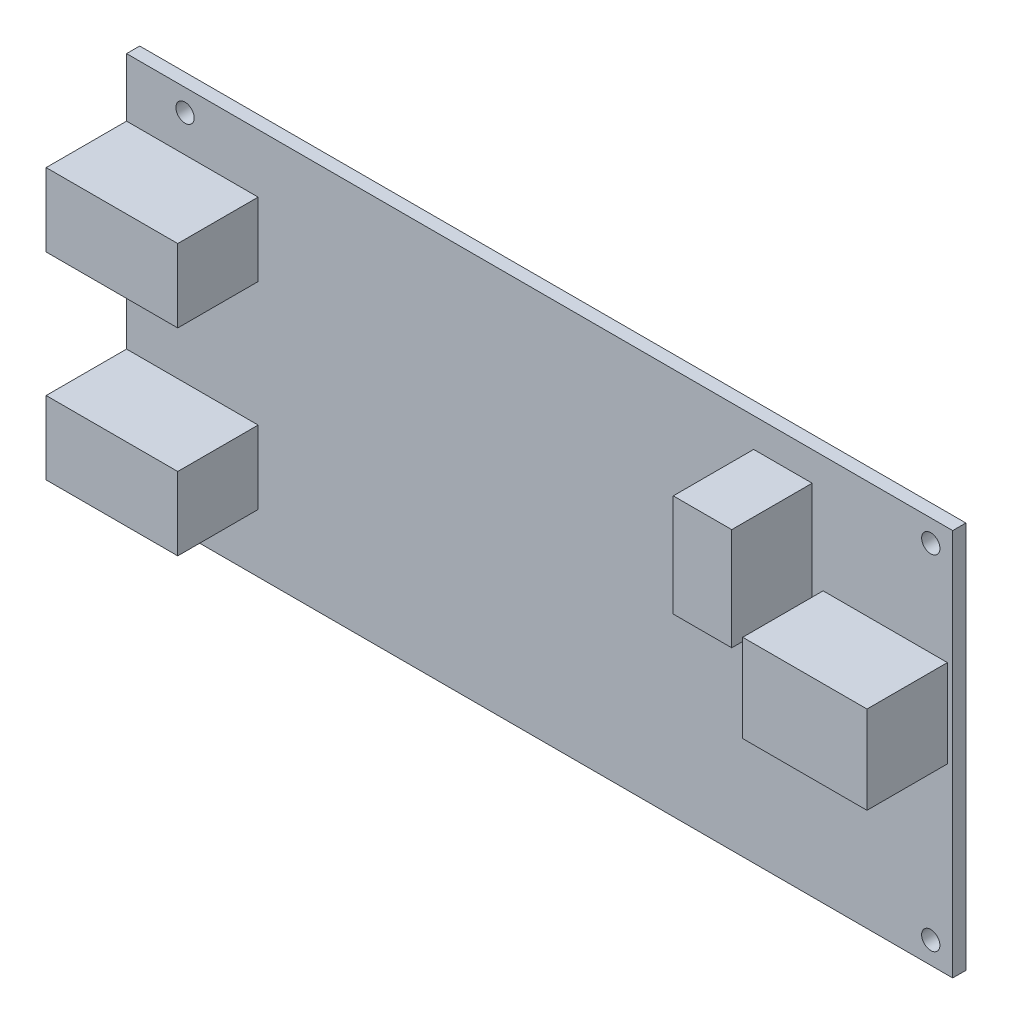
ISO-10303-21;
HEADER;
FILE_DESCRIPTION(('STEP AP214'),'2;1');
FILE_NAME('part.step','',(''),(''),'','','');
FILE_SCHEMA(('AUTOMOTIVE_DESIGN { 1 0 10303 214 1 1 1 1 }'));
ENDSEC;
DATA;
#1=APPLICATION_CONTEXT('core data for automotive mechanical design processes');
#2=APPLICATION_PROTOCOL_DEFINITION('international standard','automotive_design',2000,#1);
#3=PRODUCT_CONTEXT('',#1,'mechanical');
#4=PRODUCT('Part','Part','',(#3));
#5=PRODUCT_RELATED_PRODUCT_CATEGORY('part','',(#4));
#6=PRODUCT_DEFINITION_FORMATION('','',#4);
#7=PRODUCT_DEFINITION_CONTEXT('part definition',#1,'design');
#8=PRODUCT_DEFINITION('design','',#6,#7);
#9=PRODUCT_DEFINITION_SHAPE('','',#8);
#10=(LENGTH_UNIT() NAMED_UNIT(*) SI_UNIT(.MILLI.,.METRE.));
#11=(NAMED_UNIT(*) PLANE_ANGLE_UNIT() SI_UNIT($,.RADIAN.));
#12=(NAMED_UNIT(*) SI_UNIT($,.STERADIAN.) SOLID_ANGLE_UNIT());
#13=UNCERTAINTY_MEASURE_WITH_UNIT(LENGTH_MEASURE(1.E-05),#10,'distance_accuracy_value','');
#14=(GEOMETRIC_REPRESENTATION_CONTEXT(3) GLOBAL_UNCERTAINTY_ASSIGNED_CONTEXT((#13)) GLOBAL_UNIT_ASSIGNED_CONTEXT((#10,
#11,#12)) REPRESENTATION_CONTEXT('',''));
#15=CARTESIAN_POINT('',(0.,0.,0.));
#16=DIRECTION('',(0.,0.,1.));
#17=DIRECTION('',(1.,0.,0.));
#18=AXIS2_PLACEMENT_3D('',#15,#16,#17);
#19=CARTESIAN_POINT('',(0.,0.,1.8));
#20=DIRECTION('',(0.,0.,1.));
#21=DIRECTION('',(1.,0.,0.));
#22=AXIS2_PLACEMENT_3D('',#19,#20,#21);
#23=PLANE('',#22);
#24=CARTESIAN_POINT('',(-105.,50.,1.8));
#25=DIRECTION('',(0.,0.,1.));
#26=DIRECTION('',(1.,0.,0.));
#27=AXIS2_PLACEMENT_3D('',#24,#25,#26);
#28=CIRCLE('',#27,1.25);
#29=CARTESIAN_POINT('',(-103.75,50.,1.8));
#30=VERTEX_POINT('',#29);
#31=EDGE_CURVE('E293',#30,#30,#28,.T.);
#32=ORIENTED_EDGE('',*,*,#31,.F.);
#33=EDGE_LOOP('',(#32));
#34=FACE_BOUND('',#33,.T.);
#35=CARTESIAN_POINT('',(-3.,3.,1.8));
#36=DIRECTION('',(0.,0.,1.));
#37=DIRECTION('',(1.,0.,0.));
#38=AXIS2_PLACEMENT_3D('',#35,#36,#37);
#39=CIRCLE('',#38,1.25);
#40=CARTESIAN_POINT('',(-1.75,3.,1.8));
#41=VERTEX_POINT('',#40);
#42=EDGE_CURVE('E305',#41,#41,#39,.T.);
#43=ORIENTED_EDGE('',*,*,#42,.F.);
#44=EDGE_LOOP('',(#43));
#45=FACE_BOUND('',#44,.T.);
#46=CARTESIAN_POINT('',(-3.,50.,1.8));
#47=DIRECTION('',(0.,0.,1.));
#48=DIRECTION('',(1.,0.,0.));
#49=AXIS2_PLACEMENT_3D('',#46,#47,#48);
#50=CIRCLE('',#49,1.25);
#51=CARTESIAN_POINT('',(-1.75,50.,1.8));
#52=VERTEX_POINT('',#51);
#53=EDGE_CURVE('E299',#52,#52,#50,.T.);
#54=ORIENTED_EDGE('',*,*,#53,.F.);
#55=EDGE_LOOP('',(#54));
#56=FACE_BOUND('',#55,.T.);
#57=CARTESIAN_POINT('',(-105.,2.99999999999999,1.8));
#58=DIRECTION('',(0.,0.,1.));
#59=DIRECTION('',(1.,0.,0.));
#60=AXIS2_PLACEMENT_3D('',#57,#58,#59);
#61=CIRCLE('',#60,1.25);
#62=CARTESIAN_POINT('',(-103.75,2.99999999999999,1.8));
#63=VERTEX_POINT('',#62);
#64=EDGE_CURVE('E287',#63,#63,#61,.T.);
#65=ORIENTED_EDGE('',*,*,#64,.F.);
#66=EDGE_LOOP('',(#65));
#67=FACE_BOUND('',#66,.T.);
#68=DIRECTION('',(1.,0.,0.));
#69=VECTOR('',#68,1.);
#70=CARTESIAN_POINT('',(-17.7238457929842,25.,1.8));
#71=LINE('',#70,#69);
#72=CARTESIAN_POINT('',(-17.7238457929842,25.,1.8));
#73=VERTEX_POINT('',#72);
#74=CARTESIAN_POINT('',(-0.723845792984175,25.,1.8));
#75=VERTEX_POINT('',#74);
#76=EDGE_CURVE('E271',#73,#75,#71,.T.);
#77=ORIENTED_EDGE('',*,*,#76,.F.);
#78=DIRECTION('',(0.,-1.,0.));
#79=VECTOR('',#78,1.);
#80=CARTESIAN_POINT('',(-17.7238457929842,37.,1.8));
#81=LINE('',#80,#79);
#82=CARTESIAN_POINT('',(-17.7238457929842,37.,1.8));
#83=VERTEX_POINT('',#82);
#84=EDGE_CURVE('E257',#83,#73,#81,.T.);
#85=ORIENTED_EDGE('',*,*,#84,.F.);
#86=DIRECTION('',(-1.,0.,0.));
#87=VECTOR('',#86,1.);
#88=CARTESIAN_POINT('',(-17.7238457929842,37.,1.8));
#89=LINE('',#88,#87);
#90=CARTESIAN_POINT('',(-0.723845792984176,37.,1.8));
#91=VERTEX_POINT('',#90);
#92=EDGE_CURVE('E262',#91,#83,#89,.T.);
#93=ORIENTED_EDGE('',*,*,#92,.F.);
#94=DIRECTION('',(0.,1.,0.));
#95=VECTOR('',#94,1.);
#96=CARTESIAN_POINT('',(-0.723845792984176,37.,1.8));
#97=LINE('',#96,#95);
#98=EDGE_CURVE('E273',#75,#91,#97,.T.);
#99=ORIENTED_EDGE('',*,*,#98,.F.);
#100=EDGE_LOOP('',(#77,#85,#93,#99));
#101=FACE_BOUND('',#100,.T.);
#102=DIRECTION('',(-1.,0.,0.));
#103=VECTOR('',#102,1.);
#104=CARTESIAN_POINT('',(-19.2238457929842,49.,1.8));
#105=LINE('',#104,#103);
#106=CARTESIAN_POINT('',(-19.2238457929842,49.,1.8));
#107=VERTEX_POINT('',#106);
#108=CARTESIAN_POINT('',(-27.2238457929842,49.,1.8));
#109=VERTEX_POINT('',#108);
#110=EDGE_CURVE('E242',#107,#109,#105,.T.);
#111=ORIENTED_EDGE('',*,*,#110,.F.);
#112=DIRECTION('',(0.,1.,0.));
#113=VECTOR('',#112,1.);
#114=CARTESIAN_POINT('',(-19.2238457929842,49.,1.8));
#115=LINE('',#114,#113);
#116=CARTESIAN_POINT('',(-19.2238457929842,35.,1.8));
#117=VERTEX_POINT('',#116);
#118=EDGE_CURVE('E228',#117,#107,#115,.T.);
#119=ORIENTED_EDGE('',*,*,#118,.F.);
#120=DIRECTION('',(1.,0.,0.));
#121=VECTOR('',#120,1.);
#122=CARTESIAN_POINT('',(-19.2238457929842,35.,1.8));
#123=LINE('',#122,#121);
#124=CARTESIAN_POINT('',(-27.2238457929842,35.,1.8));
#125=VERTEX_POINT('',#124);
#126=EDGE_CURVE('E233',#125,#117,#123,.T.);
#127=ORIENTED_EDGE('',*,*,#126,.F.);
#128=DIRECTION('',(0.,-1.,0.));
#129=VECTOR('',#128,1.);
#130=CARTESIAN_POINT('',(-27.2238457929842,49.,1.8));
#131=LINE('',#130,#129);
#132=EDGE_CURVE('E244',#109,#125,#131,.T.);
#133=ORIENTED_EDGE('',*,*,#132,.F.);
#134=EDGE_LOOP('',(#111,#119,#127,#133));
#135=FACE_BOUND('',#134,.T.);
#136=DIRECTION('',(0.,1.,0.));
#137=VECTOR('',#136,1.);
#138=CARTESIAN_POINT('',(-95.,8.,1.8));
#139=LINE('',#138,#137);
#140=CARTESIAN_POINT('',(-95.,8.,1.8));
#141=VERTEX_POINT('',#140);
#142=CARTESIAN_POINT('',(-95.,18.,1.8));
#143=VERTEX_POINT('',#142);
#144=EDGE_CURVE('E49',#141,#143,#139,.T.);
#145=ORIENTED_EDGE('',*,*,#144,.F.);
#146=DIRECTION('',(1.,0.,0.));
#147=VECTOR('',#146,1.);
#148=CARTESIAN_POINT('',(-113.,8.,1.8));
#149=LINE('',#148,#147);
#150=CARTESIAN_POINT('',(-113.,8.,1.8));
#151=VERTEX_POINT('',#150);
#152=EDGE_CURVE('E351',#151,#141,#149,.T.);
#153=ORIENTED_EDGE('',*,*,#152,.F.);
#154=DIRECTION('',(0.,-1.,0.));
#155=VECTOR('',#154,1.);
#156=CARTESIAN_POINT('',(-113.,0.,1.8));
#157=LINE('',#156,#155);
#158=CARTESIAN_POINT('',(-113.,0.,1.8));
#159=VERTEX_POINT('',#158);
#160=EDGE_CURVE('E192',#151,#159,#157,.T.);
#161=ORIENTED_EDGE('',*,*,#160,.T.);
#162=DIRECTION('',(1.,0.,0.));
#163=VECTOR('',#162,1.);
#164=CARTESIAN_POINT('',(0.,0.,1.8));
#165=LINE('',#164,#163);
#166=CARTESIAN_POINT('',(0.,0.,1.8));
#167=VERTEX_POINT('',#166);
#168=EDGE_CURVE('E319',#159,#167,#165,.T.);
#169=ORIENTED_EDGE('',*,*,#168,.T.);
#170=DIRECTION('',(0.,1.,0.));
#171=VECTOR('',#170,1.);
#172=CARTESIAN_POINT('',(0.,0.,1.8));
#173=LINE('',#172,#171);
#174=CARTESIAN_POINT('',(0.,53.,1.8));
#175=VERTEX_POINT('',#174);
#176=EDGE_CURVE('E311',#167,#175,#173,.T.);
#177=ORIENTED_EDGE('',*,*,#176,.T.);
#178=DIRECTION('',(-1.,0.,0.));
#179=VECTOR('',#178,1.);
#180=CARTESIAN_POINT('',(0.,53.,1.8));
#181=LINE('',#180,#179);
#182=CARTESIAN_POINT('',(-113.,53.,1.8));
#183=VERTEX_POINT('',#182);
#184=EDGE_CURVE('E314',#175,#183,#181,.T.);
#185=ORIENTED_EDGE('',*,*,#184,.T.);
#186=CARTESIAN_POINT('',(-113.,45.,1.8));
#187=VERTEX_POINT('',#186);
#188=EDGE_CURVE('E317',#183,#187,#157,.T.);
#189=ORIENTED_EDGE('',*,*,#188,.T.);
#190=DIRECTION('',(-1.,0.,0.));
#191=VECTOR('',#190,1.);
#192=CARTESIAN_POINT('',(-113.,45.,1.8));
#193=LINE('',#192,#191);
#194=CARTESIAN_POINT('',(-95.,45.,1.8));
#195=VERTEX_POINT('',#194);
#196=EDGE_CURVE('E206',#195,#187,#193,.T.);
#197=ORIENTED_EDGE('',*,*,#196,.F.);
#198=DIRECTION('',(0.,1.,0.));
#199=VECTOR('',#198,1.);
#200=CARTESIAN_POINT('',(-95.,35.,1.8));
#201=LINE('',#200,#199);
#202=CARTESIAN_POINT('',(-95.,35.,1.8));
#203=VERTEX_POINT('',#202);
#204=EDGE_CURVE('E196',#203,#195,#201,.T.);
#205=ORIENTED_EDGE('',*,*,#204,.F.);
#206=DIRECTION('',(1.,0.,0.));
#207=VECTOR('',#206,1.);
#208=CARTESIAN_POINT('',(-113.,35.,1.8));
#209=LINE('',#208,#207);
#210=CARTESIAN_POINT('',(-113.,35.,1.8));
#211=VERTEX_POINT('',#210);
#212=EDGE_CURVE('E193',#211,#203,#209,.T.);
#213=ORIENTED_EDGE('',*,*,#212,.F.);
#214=CARTESIAN_POINT('',(-113.,18.,1.8));
#215=VERTEX_POINT('',#214);
#216=EDGE_CURVE('E320',#211,#215,#157,.T.);
#217=ORIENTED_EDGE('',*,*,#216,.T.);
#218=DIRECTION('',(-1.,0.,0.));
#219=VECTOR('',#218,1.);
#220=CARTESIAN_POINT('',(-113.,18.,1.8));
#221=LINE('',#220,#219);
#222=EDGE_CURVE('E54',#143,#215,#221,.T.);
#223=ORIENTED_EDGE('',*,*,#222,.F.);
#224=EDGE_LOOP('',(#145,#153,#161,#169,#177,#185,#189,#197,#205,#213,#217,#223));
#225=FACE_BOUND('',#224,.T.);
#226=ADVANCED_FACE('F34',(#34,#45,#56,#67,#101,#135,#225),#23,.T.);
#227=CARTESIAN_POINT('',(0.,0.,0.));
#228=DIRECTION('',(0.,0.,1.));
#229=DIRECTION('',(1.,0.,0.));
#230=AXIS2_PLACEMENT_3D('',#227,#228,#229);
#231=PLANE('',#230);
#232=DIRECTION('',(0.,1.,0.));
#233=VECTOR('',#232,1.);
#234=CARTESIAN_POINT('',(0.,0.,0.));
#235=LINE('',#234,#233);
#236=CARTESIAN_POINT('',(0.,0.,0.));
#237=VERTEX_POINT('',#236);
#238=CARTESIAN_POINT('',(0.,53.,0.));
#239=VERTEX_POINT('',#238);
#240=EDGE_CURVE('E308',#237,#239,#235,.T.);
#241=ORIENTED_EDGE('',*,*,#240,.F.);
#242=DIRECTION('',(1.,0.,0.));
#243=VECTOR('',#242,1.);
#244=CARTESIAN_POINT('',(0.,0.,0.));
#245=LINE('',#244,#243);
#246=CARTESIAN_POINT('',(-113.,0.,0.));
#247=VERTEX_POINT('',#246);
#248=EDGE_CURVE('E315',#247,#237,#245,.T.);
#249=ORIENTED_EDGE('',*,*,#248,.F.);
#250=DIRECTION('',(0.,-1.,0.));
#251=VECTOR('',#250,1.);
#252=CARTESIAN_POINT('',(-113.,0.,0.));
#253=LINE('',#252,#251);
#254=CARTESIAN_POINT('',(-113.,53.,0.));
#255=VERTEX_POINT('',#254);
#256=EDGE_CURVE('E327',#255,#247,#253,.T.);
#257=ORIENTED_EDGE('',*,*,#256,.F.);
#258=DIRECTION('',(-1.,0.,0.));
#259=VECTOR('',#258,1.);
#260=CARTESIAN_POINT('',(0.,53.,0.));
#261=LINE('',#260,#259);
#262=EDGE_CURVE('E325',#239,#255,#261,.T.);
#263=ORIENTED_EDGE('',*,*,#262,.F.);
#264=EDGE_LOOP('',(#241,#249,#257,#263));
#265=FACE_BOUND('',#264,.T.);
#266=CARTESIAN_POINT('',(-3.,3.,0.));
#267=DIRECTION('',(0.,0.,1.));
#268=DIRECTION('',(1.,0.,0.));
#269=AXIS2_PLACEMENT_3D('',#266,#267,#268);
#270=CIRCLE('',#269,1.25);
#271=CARTESIAN_POINT('',(-1.75,3.,0.));
#272=VERTEX_POINT('',#271);
#273=EDGE_CURVE('E302',#272,#272,#270,.T.);
#274=ORIENTED_EDGE('',*,*,#273,.T.);
#275=EDGE_LOOP('',(#274));
#276=FACE_BOUND('',#275,.T.);
#277=CARTESIAN_POINT('',(-3.,50.,0.));
#278=DIRECTION('',(0.,0.,1.));
#279=DIRECTION('',(1.,0.,0.));
#280=AXIS2_PLACEMENT_3D('',#277,#278,#279);
#281=CIRCLE('',#280,1.25);
#282=CARTESIAN_POINT('',(-1.75,50.,0.));
#283=VERTEX_POINT('',#282);
#284=EDGE_CURVE('E296',#283,#283,#281,.T.);
#285=ORIENTED_EDGE('',*,*,#284,.T.);
#286=EDGE_LOOP('',(#285));
#287=FACE_BOUND('',#286,.T.);
#288=CARTESIAN_POINT('',(-105.,50.,0.));
#289=DIRECTION('',(0.,0.,1.));
#290=DIRECTION('',(1.,0.,0.));
#291=AXIS2_PLACEMENT_3D('',#288,#289,#290);
#292=CIRCLE('',#291,1.25);
#293=CARTESIAN_POINT('',(-103.75,50.,0.));
#294=VERTEX_POINT('',#293);
#295=EDGE_CURVE('E290',#294,#294,#292,.T.);
#296=ORIENTED_EDGE('',*,*,#295,.T.);
#297=EDGE_LOOP('',(#296));
#298=FACE_BOUND('',#297,.T.);
#299=CARTESIAN_POINT('',(-105.,2.99999999999999,0.));
#300=DIRECTION('',(0.,0.,1.));
#301=DIRECTION('',(1.,0.,0.));
#302=AXIS2_PLACEMENT_3D('',#299,#300,#301);
#303=CIRCLE('',#302,1.25);
#304=CARTESIAN_POINT('',(-103.75,2.99999999999999,0.));
#305=VERTEX_POINT('',#304);
#306=EDGE_CURVE('E286',#305,#305,#303,.T.);
#307=ORIENTED_EDGE('',*,*,#306,.T.);
#308=EDGE_LOOP('',(#307));
#309=FACE_BOUND('',#308,.T.);
#310=ADVANCED_FACE('F342',(#265,#276,#287,#298,#309),#231,.F.);
#311=CARTESIAN_POINT('',(0.,0.,1.8));
#312=DIRECTION('',(-1.,0.,0.));
#313=DIRECTION('',(0.,0.,1.));
#314=AXIS2_PLACEMENT_3D('',#311,#312,#313);
#315=PLANE('',#314);
#316=ORIENTED_EDGE('',*,*,#240,.T.);
#317=DIRECTION('',(0.,0.,-1.));
#318=VECTOR('',#317,1.);
#319=CARTESIAN_POINT('',(0.,53.,1.8));
#320=LINE('',#319,#318);
#321=EDGE_CURVE('E11',#175,#239,#320,.T.);
#322=ORIENTED_EDGE('',*,*,#321,.F.);
#323=ORIENTED_EDGE('',*,*,#176,.F.);
#324=DIRECTION('',(0.,0.,-1.));
#325=VECTOR('',#324,1.);
#326=CARTESIAN_POINT('',(0.,0.,1.8));
#327=LINE('',#326,#325);
#328=EDGE_CURVE('E322',#167,#237,#327,.T.);
#329=ORIENTED_EDGE('',*,*,#328,.T.);
#330=EDGE_LOOP('',(#316,#322,#323,#329));
#331=FACE_BOUND('',#330,.T.);
#332=ADVANCED_FACE('F36',(#331),#315,.F.);
#333=CARTESIAN_POINT('',(0.,53.,1.8));
#334=DIRECTION('',(0.,-1.,0.));
#335=DIRECTION('',(1.,0.,0.));
#336=AXIS2_PLACEMENT_3D('',#333,#334,#335);
#337=PLANE('',#336);
#338=ORIENTED_EDGE('',*,*,#262,.T.);
#339=DIRECTION('',(0.,0.,-1.));
#340=VECTOR('',#339,1.);
#341=CARTESIAN_POINT('',(-113.,53.,1.8));
#342=LINE('',#341,#340);
#343=EDGE_CURVE('E42',#183,#255,#342,.T.);
#344=ORIENTED_EDGE('',*,*,#343,.F.);
#345=ORIENTED_EDGE('',*,*,#184,.F.);
#346=ORIENTED_EDGE('',*,*,#321,.T.);
#347=EDGE_LOOP('',(#338,#344,#345,#346));
#348=FACE_BOUND('',#347,.T.);
#349=ADVANCED_FACE('F392',(#348),#337,.F.);
#350=CARTESIAN_POINT('',(-113.,0.,1.8));
#351=DIRECTION('',(1.,0.,0.));
#352=DIRECTION('',(0.,0.,-1.));
#353=AXIS2_PLACEMENT_3D('',#350,#351,#352);
#354=PLANE('',#353);
#355=ORIENTED_EDGE('',*,*,#256,.T.);
#356=DIRECTION('',(0.,0.,-1.));
#357=VECTOR('',#356,1.);
#358=CARTESIAN_POINT('',(-113.,0.,1.8));
#359=LINE('',#358,#357);
#360=EDGE_CURVE('E332',#159,#247,#359,.T.);
#361=ORIENTED_EDGE('',*,*,#360,.F.);
#362=ORIENTED_EDGE('',*,*,#160,.F.);
#363=DIRECTION('',(0.,0.,-1.));
#364=VECTOR('',#363,1.);
#365=CARTESIAN_POINT('',(-113.,8.,12.8));
#366=LINE('',#365,#364);
#367=CARTESIAN_POINT('',(-113.,8.,12.8));
#368=VERTEX_POINT('',#367);
#369=EDGE_CURVE('E174',#368,#151,#366,.T.);
#370=ORIENTED_EDGE('',*,*,#369,.F.);
#371=DIRECTION('',(0.,-1.,0.));
#372=VECTOR('',#371,1.);
#373=CARTESIAN_POINT('',(-113.,8.,12.8));
#374=LINE('',#373,#372);
#375=CARTESIAN_POINT('',(-113.,18.,12.8));
#376=VERTEX_POINT('',#375);
#377=EDGE_CURVE('E180',#376,#368,#374,.T.);
#378=ORIENTED_EDGE('',*,*,#377,.F.);
#379=DIRECTION('',(0.,0.,-1.));
#380=VECTOR('',#379,1.);
#381=CARTESIAN_POINT('',(-113.,18.,12.8));
#382=LINE('',#381,#380);
#383=EDGE_CURVE('E357',#376,#215,#382,.T.);
#384=ORIENTED_EDGE('',*,*,#383,.T.);
#385=ORIENTED_EDGE('',*,*,#216,.F.);
#386=DIRECTION('',(0.,0.,-1.));
#387=VECTOR('',#386,1.);
#388=CARTESIAN_POINT('',(-113.,35.,12.8));
#389=LINE('',#388,#387);
#390=CARTESIAN_POINT('',(-113.,35.,12.8));
#391=VERTEX_POINT('',#390);
#392=EDGE_CURVE('E225',#391,#211,#389,.T.);
#393=ORIENTED_EDGE('',*,*,#392,.F.);
#394=DIRECTION('',(0.,-1.,0.));
#395=VECTOR('',#394,1.);
#396=CARTESIAN_POINT('',(-113.,35.,12.8));
#397=LINE('',#396,#395);
#398=CARTESIAN_POINT('',(-113.,45.,12.8));
#399=VERTEX_POINT('',#398);
#400=EDGE_CURVE('E202',#399,#391,#397,.T.);
#401=ORIENTED_EDGE('',*,*,#400,.F.);
#402=DIRECTION('',(0.,0.,-1.));
#403=VECTOR('',#402,1.);
#404=CARTESIAN_POINT('',(-113.,45.,12.8));
#405=LINE('',#404,#403);
#406=EDGE_CURVE('E211',#399,#187,#405,.T.);
#407=ORIENTED_EDGE('',*,*,#406,.T.);
#408=ORIENTED_EDGE('',*,*,#188,.F.);
#409=ORIENTED_EDGE('',*,*,#343,.T.);
#410=EDGE_LOOP('',(#355,#361,#362,#370,#378,#384,#385,#393,#401,#407,#408,#409));
#411=FACE_BOUND('',#410,.T.);
#412=ADVANCED_FACE('F190',(#411),#354,.F.);
#413=CARTESIAN_POINT('',(0.,0.,1.8));
#414=DIRECTION('',(0.,1.,0.));
#415=DIRECTION('',(0.,0.,1.));
#416=AXIS2_PLACEMENT_3D('',#413,#414,#415);
#417=PLANE('',#416);
#418=ORIENTED_EDGE('',*,*,#248,.T.);
#419=ORIENTED_EDGE('',*,*,#328,.F.);
#420=ORIENTED_EDGE('',*,*,#168,.F.);
#421=ORIENTED_EDGE('',*,*,#360,.T.);
#422=EDGE_LOOP('',(#418,#419,#420,#421));
#423=FACE_BOUND('',#422,.T.);
#424=ADVANCED_FACE('F346',(#423),#417,.F.);
#425=CARTESIAN_POINT('',(-3.,3.,1.8));
#426=DIRECTION('',(0.,0.,-1.));
#427=DIRECTION('',(-1.,0.,0.));
#428=AXIS2_PLACEMENT_3D('',#425,#426,#427);
#429=CYLINDRICAL_SURFACE('',#428,1.25);
#430=ORIENTED_EDGE('',*,*,#42,.T.);
#431=EDGE_LOOP('',(#430));
#432=FACE_BOUND('',#431,.T.);
#433=ORIENTED_EDGE('',*,*,#273,.F.);
#434=EDGE_LOOP('',(#433));
#435=FACE_BOUND('',#434,.T.);
#436=ADVANCED_FACE('F386',(#432,#435),#429,.F.);
#437=CARTESIAN_POINT('',(-3.,50.,1.8));
#438=DIRECTION('',(0.,0.,-1.));
#439=DIRECTION('',(-1.,0.,0.));
#440=AXIS2_PLACEMENT_3D('',#437,#438,#439);
#441=CYLINDRICAL_SURFACE('',#440,1.25);
#442=ORIENTED_EDGE('',*,*,#53,.T.);
#443=EDGE_LOOP('',(#442));
#444=FACE_BOUND('',#443,.T.);
#445=ORIENTED_EDGE('',*,*,#284,.F.);
#446=EDGE_LOOP('',(#445));
#447=FACE_BOUND('',#446,.T.);
#448=ADVANCED_FACE('F432',(#444,#447),#441,.F.);
#449=CARTESIAN_POINT('',(-105.,50.,1.8));
#450=DIRECTION('',(0.,0.,-1.));
#451=DIRECTION('',(-1.,0.,0.));
#452=AXIS2_PLACEMENT_3D('',#449,#450,#451);
#453=CYLINDRICAL_SURFACE('',#452,1.25);
#454=ORIENTED_EDGE('',*,*,#31,.T.);
#455=EDGE_LOOP('',(#454));
#456=FACE_BOUND('',#455,.T.);
#457=ORIENTED_EDGE('',*,*,#295,.F.);
#458=EDGE_LOOP('',(#457));
#459=FACE_BOUND('',#458,.T.);
#460=ADVANCED_FACE('F440',(#456,#459),#453,.F.);
#461=CARTESIAN_POINT('',(-105.,2.99999999999999,1.8));
#462=DIRECTION('',(0.,0.,-1.));
#463=DIRECTION('',(-1.,0.,0.));
#464=AXIS2_PLACEMENT_3D('',#461,#462,#463);
#465=CYLINDRICAL_SURFACE('',#464,1.25);
#466=ORIENTED_EDGE('',*,*,#64,.T.);
#467=EDGE_LOOP('',(#466));
#468=FACE_BOUND('',#467,.T.);
#469=ORIENTED_EDGE('',*,*,#306,.F.);
#470=EDGE_LOOP('',(#469));
#471=FACE_BOUND('',#470,.T.);
#472=ADVANCED_FACE('F448',(#468,#471),#465,.F.);
#473=CARTESIAN_POINT('',(-17.7238457929842,37.,12.8));
#474=DIRECTION('',(1.,0.,0.));
#475=DIRECTION('',(0.,0.,-1.));
#476=AXIS2_PLACEMENT_3D('',#473,#474,#475);
#477=PLANE('',#476);
#478=ORIENTED_EDGE('',*,*,#84,.T.);
#479=DIRECTION('',(0.,0.,-1.));
#480=VECTOR('',#479,1.);
#481=CARTESIAN_POINT('',(-17.7238457929842,25.,12.8));
#482=LINE('',#481,#480);
#483=CARTESIAN_POINT('',(-17.7238457929842,25.,12.8));
#484=VERTEX_POINT('',#483);
#485=EDGE_CURVE('E284',#484,#73,#482,.T.);
#486=ORIENTED_EDGE('',*,*,#485,.F.);
#487=DIRECTION('',(0.,-1.,0.));
#488=VECTOR('',#487,1.);
#489=CARTESIAN_POINT('',(-17.7238457929842,37.,12.8));
#490=LINE('',#489,#488);
#491=CARTESIAN_POINT('',(-17.7238457929842,37.,12.8));
#492=VERTEX_POINT('',#491);
#493=EDGE_CURVE('E258',#492,#484,#490,.T.);
#494=ORIENTED_EDGE('',*,*,#493,.F.);
#495=DIRECTION('',(0.,0.,-1.));
#496=VECTOR('',#495,1.);
#497=CARTESIAN_POINT('',(-17.7238457929842,37.,12.8));
#498=LINE('',#497,#496);
#499=EDGE_CURVE('E268',#492,#83,#498,.T.);
#500=ORIENTED_EDGE('',*,*,#499,.T.);
#501=EDGE_LOOP('',(#478,#486,#494,#500));
#502=FACE_BOUND('',#501,.T.);
#503=ADVANCED_FACE('F456',(#502),#477,.F.);
#504=CARTESIAN_POINT('',(-17.7238457929842,25.,12.8));
#505=DIRECTION('',(0.,1.,0.));
#506=DIRECTION('',(-1.,0.,0.));
#507=AXIS2_PLACEMENT_3D('',#504,#505,#506);
#508=PLANE('',#507);
#509=ORIENTED_EDGE('',*,*,#76,.T.);
#510=DIRECTION('',(0.,0.,-1.));
#511=VECTOR('',#510,1.);
#512=CARTESIAN_POINT('',(-0.723845792984175,25.,12.8));
#513=LINE('',#512,#511);
#514=CARTESIAN_POINT('',(-0.723845792984175,25.,12.8));
#515=VERTEX_POINT('',#514);
#516=EDGE_CURVE('E281',#515,#75,#513,.T.);
#517=ORIENTED_EDGE('',*,*,#516,.F.);
#518=DIRECTION('',(1.,0.,0.));
#519=VECTOR('',#518,1.);
#520=CARTESIAN_POINT('',(-17.7238457929842,25.,12.8));
#521=LINE('',#520,#519);
#522=EDGE_CURVE('E261',#484,#515,#521,.T.);
#523=ORIENTED_EDGE('',*,*,#522,.F.);
#524=ORIENTED_EDGE('',*,*,#485,.T.);
#525=EDGE_LOOP('',(#509,#517,#523,#524));
#526=FACE_BOUND('',#525,.T.);
#527=ADVANCED_FACE('F475',(#526),#508,.F.);
#528=CARTESIAN_POINT('',(-0.723845792984176,37.,12.8));
#529=DIRECTION('',(-1.,0.,0.));
#530=DIRECTION('',(0.,-1.,0.));
#531=AXIS2_PLACEMENT_3D('',#528,#529,#530);
#532=PLANE('',#531);
#533=ORIENTED_EDGE('',*,*,#98,.T.);
#534=DIRECTION('',(0.,0.,-1.));
#535=VECTOR('',#534,1.);
#536=CARTESIAN_POINT('',(-0.723845792984176,37.,12.8));
#537=LINE('',#536,#535);
#538=CARTESIAN_POINT('',(-0.723845792984176,37.,12.8));
#539=VERTEX_POINT('',#538);
#540=EDGE_CURVE('E279',#539,#91,#537,.T.);
#541=ORIENTED_EDGE('',*,*,#540,.F.);
#542=DIRECTION('',(0.,1.,0.));
#543=VECTOR('',#542,1.);
#544=CARTESIAN_POINT('',(-0.723845792984176,37.,12.8));
#545=LINE('',#544,#543);
#546=EDGE_CURVE('E264',#515,#539,#545,.T.);
#547=ORIENTED_EDGE('',*,*,#546,.F.);
#548=ORIENTED_EDGE('',*,*,#516,.T.);
#549=EDGE_LOOP('',(#533,#541,#547,#548));
#550=FACE_BOUND('',#549,.T.);
#551=ADVANCED_FACE('F485',(#550),#532,.F.);
#552=CARTESIAN_POINT('',(-17.7238457929842,37.,12.8));
#553=DIRECTION('',(0.,-1.,0.));
#554=DIRECTION('',(0.,0.,-1.));
#555=AXIS2_PLACEMENT_3D('',#552,#553,#554);
#556=PLANE('',#555);
#557=ORIENTED_EDGE('',*,*,#92,.T.);
#558=ORIENTED_EDGE('',*,*,#499,.F.);
#559=DIRECTION('',(-1.,0.,0.));
#560=VECTOR('',#559,1.);
#561=CARTESIAN_POINT('',(-17.7238457929842,37.,12.8));
#562=LINE('',#561,#560);
#563=EDGE_CURVE('E266',#539,#492,#562,.T.);
#564=ORIENTED_EDGE('',*,*,#563,.F.);
#565=ORIENTED_EDGE('',*,*,#540,.T.);
#566=EDGE_LOOP('',(#557,#558,#564,#565));
#567=FACE_BOUND('',#566,.T.);
#568=ADVANCED_FACE('F495',(#567),#556,.F.);
#569=CARTESIAN_POINT('',(0.,0.,12.8));
#570=DIRECTION('',(0.,0.,1.));
#571=DIRECTION('',(1.,0.,0.));
#572=AXIS2_PLACEMENT_3D('',#569,#570,#571);
#573=PLANE('',#572);
#574=ORIENTED_EDGE('',*,*,#493,.T.);
#575=ORIENTED_EDGE('',*,*,#522,.T.);
#576=ORIENTED_EDGE('',*,*,#546,.T.);
#577=ORIENTED_EDGE('',*,*,#563,.T.);
#578=EDGE_LOOP('',(#574,#575,#576,#577));
#579=FACE_BOUND('',#578,.T.);
#580=ADVANCED_FACE('F505',(#579),#573,.T.);
#581=CARTESIAN_POINT('',(-19.2238457929842,49.,12.8));
#582=DIRECTION('',(-1.,0.,0.));
#583=DIRECTION('',(0.,-1.,0.));
#584=AXIS2_PLACEMENT_3D('',#581,#582,#583);
#585=PLANE('',#584);
#586=ORIENTED_EDGE('',*,*,#118,.T.);
#587=DIRECTION('',(0.,0.,-1.));
#588=VECTOR('',#587,1.);
#589=CARTESIAN_POINT('',(-19.2238457929842,49.,12.8));
#590=LINE('',#589,#588);
#591=CARTESIAN_POINT('',(-19.2238457929842,49.,12.8));
#592=VERTEX_POINT('',#591);
#593=EDGE_CURVE('E255',#592,#107,#590,.T.);
#594=ORIENTED_EDGE('',*,*,#593,.F.);
#595=DIRECTION('',(0.,1.,0.));
#596=VECTOR('',#595,1.);
#597=CARTESIAN_POINT('',(-19.2238457929842,49.,12.8));
#598=LINE('',#597,#596);
#599=CARTESIAN_POINT('',(-19.2238457929842,35.,12.8));
#600=VERTEX_POINT('',#599);
#601=EDGE_CURVE('E229',#600,#592,#598,.T.);
#602=ORIENTED_EDGE('',*,*,#601,.F.);
#603=DIRECTION('',(0.,0.,-1.));
#604=VECTOR('',#603,1.);
#605=CARTESIAN_POINT('',(-19.2238457929842,35.,12.8));
#606=LINE('',#605,#604);
#607=EDGE_CURVE('E239',#600,#117,#606,.T.);
#608=ORIENTED_EDGE('',*,*,#607,.T.);
#609=EDGE_LOOP('',(#586,#594,#602,#608));
#610=FACE_BOUND('',#609,.T.);
#611=ADVANCED_FACE('F515',(#610),#585,.F.);
#612=CARTESIAN_POINT('',(-19.2238457929842,49.,12.8));
#613=DIRECTION('',(0.,-1.,0.));
#614=DIRECTION('',(0.,0.,-1.));
#615=AXIS2_PLACEMENT_3D('',#612,#613,#614);
#616=PLANE('',#615);
#617=ORIENTED_EDGE('',*,*,#110,.T.);
#618=DIRECTION('',(0.,0.,-1.));
#619=VECTOR('',#618,1.);
#620=CARTESIAN_POINT('',(-27.2238457929842,49.,12.8));
#621=LINE('',#620,#619);
#622=CARTESIAN_POINT('',(-27.2238457929842,49.,12.8));
#623=VERTEX_POINT('',#622);
#624=EDGE_CURVE('E252',#623,#109,#621,.T.);
#625=ORIENTED_EDGE('',*,*,#624,.F.);
#626=DIRECTION('',(-1.,0.,0.));
#627=VECTOR('',#626,1.);
#628=CARTESIAN_POINT('',(-19.2238457929842,49.,12.8));
#629=LINE('',#628,#627);
#630=EDGE_CURVE('E232',#592,#623,#629,.T.);
#631=ORIENTED_EDGE('',*,*,#630,.F.);
#632=ORIENTED_EDGE('',*,*,#593,.T.);
#633=EDGE_LOOP('',(#617,#625,#631,#632));
#634=FACE_BOUND('',#633,.T.);
#635=ADVANCED_FACE('F525',(#634),#616,.F.);
#636=CARTESIAN_POINT('',(-27.2238457929842,49.,12.8));
#637=DIRECTION('',(1.,0.,0.));
#638=DIRECTION('',(0.,1.,0.));
#639=AXIS2_PLACEMENT_3D('',#636,#637,#638);
#640=PLANE('',#639);
#641=ORIENTED_EDGE('',*,*,#132,.T.);
#642=DIRECTION('',(0.,0.,-1.));
#643=VECTOR('',#642,1.);
#644=CARTESIAN_POINT('',(-27.2238457929842,35.,12.8));
#645=LINE('',#644,#643);
#646=CARTESIAN_POINT('',(-27.2238457929842,35.,12.8));
#647=VERTEX_POINT('',#646);
#648=EDGE_CURVE('E250',#647,#125,#645,.T.);
#649=ORIENTED_EDGE('',*,*,#648,.F.);
#650=DIRECTION('',(0.,-1.,0.));
#651=VECTOR('',#650,1.);
#652=CARTESIAN_POINT('',(-27.2238457929842,49.,12.8));
#653=LINE('',#652,#651);
#654=EDGE_CURVE('E235',#623,#647,#653,.T.);
#655=ORIENTED_EDGE('',*,*,#654,.F.);
#656=ORIENTED_EDGE('',*,*,#624,.T.);
#657=EDGE_LOOP('',(#641,#649,#655,#656));
#658=FACE_BOUND('',#657,.T.);
#659=ADVANCED_FACE('F535',(#658),#640,.F.);
#660=CARTESIAN_POINT('',(-19.2238457929842,35.,12.8));
#661=DIRECTION('',(0.,1.,0.));
#662=DIRECTION('',(0.,0.,1.));
#663=AXIS2_PLACEMENT_3D('',#660,#661,#662);
#664=PLANE('',#663);
#665=ORIENTED_EDGE('',*,*,#126,.T.);
#666=ORIENTED_EDGE('',*,*,#607,.F.);
#667=DIRECTION('',(1.,0.,0.));
#668=VECTOR('',#667,1.);
#669=CARTESIAN_POINT('',(-19.2238457929842,35.,12.8));
#670=LINE('',#669,#668);
#671=EDGE_CURVE('E237',#647,#600,#670,.T.);
#672=ORIENTED_EDGE('',*,*,#671,.F.);
#673=ORIENTED_EDGE('',*,*,#648,.T.);
#674=EDGE_LOOP('',(#665,#666,#672,#673));
#675=FACE_BOUND('',#674,.T.);
#676=ADVANCED_FACE('F545',(#675),#664,.F.);
#677=CARTESIAN_POINT('',(0.,0.,12.8));
#678=DIRECTION('',(0.,0.,-1.));
#679=DIRECTION('',(-1.,0.,0.));
#680=AXIS2_PLACEMENT_3D('',#677,#678,#679);
#681=PLANE('',#680);
#682=ORIENTED_EDGE('',*,*,#601,.T.);
#683=ORIENTED_EDGE('',*,*,#630,.T.);
#684=ORIENTED_EDGE('',*,*,#654,.T.);
#685=ORIENTED_EDGE('',*,*,#671,.T.);
#686=EDGE_LOOP('',(#682,#683,#684,#685));
#687=FACE_BOUND('',#686,.T.);
#688=ADVANCED_FACE('F555',(#687),#681,.F.);
#689=CARTESIAN_POINT('',(-113.,35.,12.8));
#690=DIRECTION('',(0.,1.,0.));
#691=DIRECTION('',(0.,0.,1.));
#692=AXIS2_PLACEMENT_3D('',#689,#690,#691);
#693=PLANE('',#692);
#694=ORIENTED_EDGE('',*,*,#212,.T.);
#695=DIRECTION('',(0.,0.,-1.));
#696=VECTOR('',#695,1.);
#697=CARTESIAN_POINT('',(-95.,35.,12.8));
#698=LINE('',#697,#696);
#699=CARTESIAN_POINT('',(-95.,35.,12.8));
#700=VERTEX_POINT('',#699);
#701=EDGE_CURVE('E222',#700,#203,#698,.T.);
#702=ORIENTED_EDGE('',*,*,#701,.F.);
#703=DIRECTION('',(1.,0.,0.));
#704=VECTOR('',#703,1.);
#705=CARTESIAN_POINT('',(-113.,35.,12.8));
#706=LINE('',#705,#704);
#707=EDGE_CURVE('E205',#391,#700,#706,.T.);
#708=ORIENTED_EDGE('',*,*,#707,.F.);
#709=ORIENTED_EDGE('',*,*,#392,.T.);
#710=EDGE_LOOP('',(#694,#702,#708,#709));
#711=FACE_BOUND('',#710,.T.);
#712=ADVANCED_FACE('F565',(#711),#693,.F.);
#713=CARTESIAN_POINT('',(-95.,35.,12.8));
#714=DIRECTION('',(-1.,0.,0.));
#715=DIRECTION('',(0.,0.,1.));
#716=AXIS2_PLACEMENT_3D('',#713,#714,#715);
#717=PLANE('',#716);
#718=ORIENTED_EDGE('',*,*,#204,.T.);
#719=DIRECTION('',(0.,0.,-1.));
#720=VECTOR('',#719,1.);
#721=CARTESIAN_POINT('',(-95.,45.,12.8));
#722=LINE('',#721,#720);
#723=CARTESIAN_POINT('',(-95.,45.,12.8));
#724=VERTEX_POINT('',#723);
#725=EDGE_CURVE('E219',#724,#195,#722,.T.);
#726=ORIENTED_EDGE('',*,*,#725,.F.);
#727=DIRECTION('',(0.,1.,0.));
#728=VECTOR('',#727,1.);
#729=CARTESIAN_POINT('',(-95.,35.,12.8));
#730=LINE('',#729,#728);
#731=EDGE_CURVE('E208',#700,#724,#730,.T.);
#732=ORIENTED_EDGE('',*,*,#731,.F.);
#733=ORIENTED_EDGE('',*,*,#701,.T.);
#734=EDGE_LOOP('',(#718,#726,#732,#733));
#735=FACE_BOUND('',#734,.T.);
#736=ADVANCED_FACE('F575',(#735),#717,.F.);
#737=CARTESIAN_POINT('',(-113.,45.,12.8));
#738=DIRECTION('',(0.,-1.,0.));
#739=DIRECTION('',(0.,0.,-1.));
#740=AXIS2_PLACEMENT_3D('',#737,#738,#739);
#741=PLANE('',#740);
#742=ORIENTED_EDGE('',*,*,#196,.T.);
#743=ORIENTED_EDGE('',*,*,#406,.F.);
#744=DIRECTION('',(-1.,0.,0.));
#745=VECTOR('',#744,1.);
#746=CARTESIAN_POINT('',(-113.,45.,12.8));
#747=LINE('',#746,#745);
#748=EDGE_CURVE('E210',#724,#399,#747,.T.);
#749=ORIENTED_EDGE('',*,*,#748,.F.);
#750=ORIENTED_EDGE('',*,*,#725,.T.);
#751=EDGE_LOOP('',(#742,#743,#749,#750));
#752=FACE_BOUND('',#751,.T.);
#753=ADVANCED_FACE('F585',(#752),#741,.F.);
#754=CARTESIAN_POINT('',(0.,0.,12.8));
#755=DIRECTION('',(0.,0.,-1.));
#756=DIRECTION('',(-1.,0.,0.));
#757=AXIS2_PLACEMENT_3D('',#754,#755,#756);
#758=PLANE('',#757);
#759=ORIENTED_EDGE('',*,*,#400,.T.);
#760=ORIENTED_EDGE('',*,*,#707,.T.);
#761=ORIENTED_EDGE('',*,*,#731,.T.);
#762=ORIENTED_EDGE('',*,*,#748,.T.);
#763=EDGE_LOOP('',(#759,#760,#761,#762));
#764=FACE_BOUND('',#763,.T.);
#765=ADVANCED_FACE('F374',(#764),#758,.F.);
#766=CARTESIAN_POINT('',(-113.,8.,12.8));
#767=DIRECTION('',(0.,1.,0.));
#768=DIRECTION('',(0.,0.,1.));
#769=AXIS2_PLACEMENT_3D('',#766,#767,#768);
#770=PLANE('',#769);
#771=ORIENTED_EDGE('',*,*,#152,.T.);
#772=DIRECTION('',(0.,0.,-1.));
#773=VECTOR('',#772,1.);
#774=CARTESIAN_POINT('',(-95.,8.,12.8));
#775=LINE('',#774,#773);
#776=CARTESIAN_POINT('',(-95.,8.,12.8));
#777=VERTEX_POINT('',#776);
#778=EDGE_CURVE('E176',#777,#141,#775,.T.);
#779=ORIENTED_EDGE('',*,*,#778,.F.);
#780=DIRECTION('',(1.,0.,0.));
#781=VECTOR('',#780,1.);
#782=CARTESIAN_POINT('',(-113.,8.,12.8));
#783=LINE('',#782,#781);
#784=EDGE_CURVE('E170',#368,#777,#783,.T.);
#785=ORIENTED_EDGE('',*,*,#784,.F.);
#786=ORIENTED_EDGE('',*,*,#369,.T.);
#787=EDGE_LOOP('',(#771,#779,#785,#786));
#788=FACE_BOUND('',#787,.T.);
#789=ADVANCED_FACE('F172',(#788),#770,.F.);
#790=CARTESIAN_POINT('',(-95.,8.,12.8));
#791=DIRECTION('',(-1.,0.,0.));
#792=DIRECTION('',(0.,0.,1.));
#793=AXIS2_PLACEMENT_3D('',#790,#791,#792);
#794=PLANE('',#793);
#795=ORIENTED_EDGE('',*,*,#144,.T.);
#796=DIRECTION('',(0.,0.,-1.));
#797=VECTOR('',#796,1.);
#798=CARTESIAN_POINT('',(-95.,18.,12.8));
#799=LINE('',#798,#797);
#800=CARTESIAN_POINT('',(-95.,18.,12.8));
#801=VERTEX_POINT('',#800);
#802=EDGE_CURVE('E198',#801,#143,#799,.T.);
#803=ORIENTED_EDGE('',*,*,#802,.F.);
#804=DIRECTION('',(0.,1.,0.));
#805=VECTOR('',#804,1.);
#806=CARTESIAN_POINT('',(-95.,8.,12.8));
#807=LINE('',#806,#805);
#808=EDGE_CURVE('E179',#777,#801,#807,.T.);
#809=ORIENTED_EDGE('',*,*,#808,.F.);
#810=ORIENTED_EDGE('',*,*,#778,.T.);
#811=EDGE_LOOP('',(#795,#803,#809,#810));
#812=FACE_BOUND('',#811,.T.);
#813=ADVANCED_FACE('F366',(#812),#794,.F.);
#814=CARTESIAN_POINT('',(-113.,18.,12.8));
#815=DIRECTION('',(0.,-1.,0.));
#816=DIRECTION('',(0.,0.,-1.));
#817=AXIS2_PLACEMENT_3D('',#814,#815,#816);
#818=PLANE('',#817);
#819=ORIENTED_EDGE('',*,*,#222,.T.);
#820=ORIENTED_EDGE('',*,*,#383,.F.);
#821=DIRECTION('',(-1.,0.,0.));
#822=VECTOR('',#821,1.);
#823=CARTESIAN_POINT('',(-113.,18.,12.8));
#824=LINE('',#823,#822);
#825=EDGE_CURVE('E185',#801,#376,#824,.T.);
#826=ORIENTED_EDGE('',*,*,#825,.F.);
#827=ORIENTED_EDGE('',*,*,#802,.T.);
#828=EDGE_LOOP('',(#819,#820,#826,#827));
#829=FACE_BOUND('',#828,.T.);
#830=ADVANCED_FACE('F356',(#829),#818,.F.);
#831=CARTESIAN_POINT('',(0.,0.,12.8));
#832=DIRECTION('',(0.,0.,-1.));
#833=DIRECTION('',(-1.,0.,0.));
#834=AXIS2_PLACEMENT_3D('',#831,#832,#833);
#835=PLANE('',#834);
#836=ORIENTED_EDGE('',*,*,#377,.T.);
#837=ORIENTED_EDGE('',*,*,#784,.T.);
#838=ORIENTED_EDGE('',*,*,#808,.T.);
#839=ORIENTED_EDGE('',*,*,#825,.T.);
#840=EDGE_LOOP('',(#836,#837,#838,#839));
#841=FACE_BOUND('',#840,.T.);
#842=ADVANCED_FACE('F183',(#841),#835,.F.);
#843=CLOSED_SHELL('',(#226,#310,#332,#349,#412,#424,#436,#448,#460,#472,#503,#527,#551,#568,
#580,#611,#635,#659,#676,#688,#712,#736,#753,#765,#789,#813,#830,#842));
#844=MANIFOLD_SOLID_BREP('B2',#843);
#845=ADVANCED_BREP_SHAPE_REPRESENTATION('',(#18,#844),#14);
#846=SHAPE_DEFINITION_REPRESENTATION(#9,#845);
ENDSEC;
END-ISO-10303-21;
